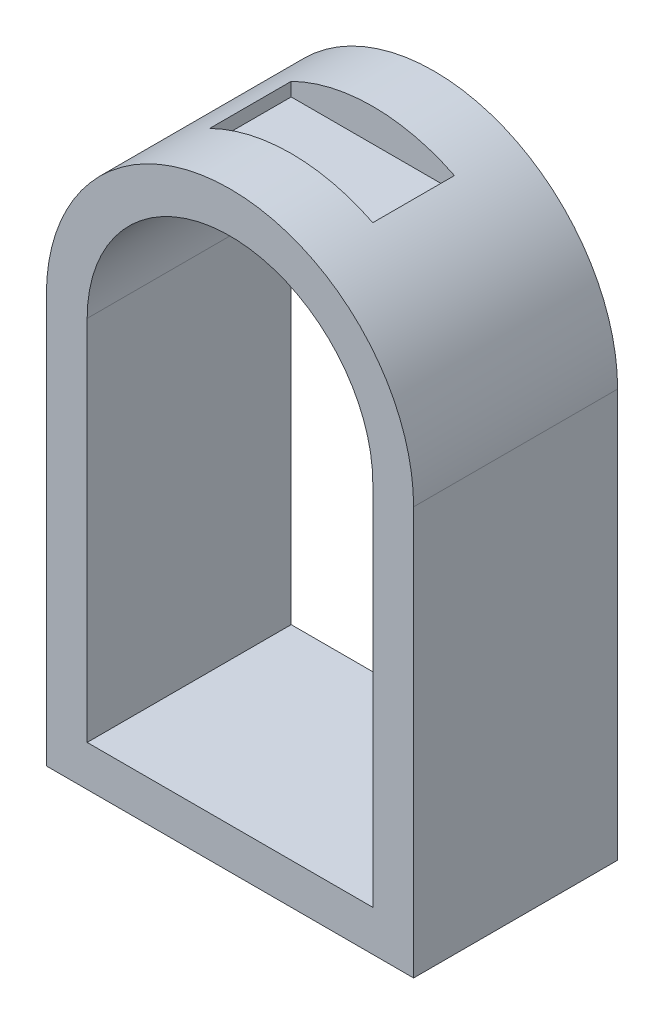
ISO-10303-21;
HEADER;
FILE_DESCRIPTION(('STEP AP214'),'2;1');
FILE_NAME('part.step','',(''),(''),'','','');
FILE_SCHEMA(('AUTOMOTIVE_DESIGN { 1 0 10303 214 1 1 1 1 }'));
ENDSEC;
DATA;
#1=APPLICATION_CONTEXT('core data for automotive mechanical design processes');
#2=APPLICATION_PROTOCOL_DEFINITION('international standard','automotive_design',2000,#1);
#3=PRODUCT_CONTEXT('',#1,'mechanical');
#4=PRODUCT('Part','Part','',(#3));
#5=PRODUCT_RELATED_PRODUCT_CATEGORY('part','',(#4));
#6=PRODUCT_DEFINITION_FORMATION('','',#4);
#7=PRODUCT_DEFINITION_CONTEXT('part definition',#1,'design');
#8=PRODUCT_DEFINITION('design','',#6,#7);
#9=PRODUCT_DEFINITION_SHAPE('','',#8);
#10=(LENGTH_UNIT() NAMED_UNIT(*) SI_UNIT(.MILLI.,.METRE.));
#11=(NAMED_UNIT(*) PLANE_ANGLE_UNIT() SI_UNIT($,.RADIAN.));
#12=(NAMED_UNIT(*) SI_UNIT($,.STERADIAN.) SOLID_ANGLE_UNIT());
#13=UNCERTAINTY_MEASURE_WITH_UNIT(LENGTH_MEASURE(1.E-05),#10,'distance_accuracy_value','');
#14=(GEOMETRIC_REPRESENTATION_CONTEXT(3) GLOBAL_UNCERTAINTY_ASSIGNED_CONTEXT((#13)) GLOBAL_UNIT_ASSIGNED_CONTEXT((#10,
#11,#12)) REPRESENTATION_CONTEXT('',''));
#15=CARTESIAN_POINT('',(0.,0.,0.));
#16=DIRECTION('',(0.,0.,1.));
#17=DIRECTION('',(1.,0.,0.));
#18=AXIS2_PLACEMENT_3D('',#15,#16,#17);
#19=CARTESIAN_POINT('',(88.8999999999999,228.6,127.));
#20=DIRECTION('',(0.,0.,-1.));
#21=DIRECTION('',(-1.,0.,0.));
#22=AXIS2_PLACEMENT_3D('',#19,#20,#21);
#23=CYLINDRICAL_SURFACE('',#22,114.3);
#24=CARTESIAN_POINT('',(88.8999999999999,228.6,0.));
#25=DIRECTION('',(0.,0.,1.));
#26=DIRECTION('',(-1.,0.,0.));
#27=AXIS2_PLACEMENT_3D('',#24,#25,#26);
#28=CIRCLE('',#27,114.3);
#29=CARTESIAN_POINT('',(203.2,228.6,0.));
#30=VERTEX_POINT('',#29);
#31=CARTESIAN_POINT('',(-25.4,228.6,0.));
#32=VERTEX_POINT('',#31);
#33=EDGE_CURVE('E236',#30,#32,#28,.T.);
#34=ORIENTED_EDGE('',*,*,#33,.T.);
#35=DIRECTION('',(0.,0.,-1.));
#36=VECTOR('',#35,1.);
#37=CARTESIAN_POINT('',(-25.4,228.6,127.));
#38=LINE('',#37,#36);
#39=CARTESIAN_POINT('',(-25.4,228.6,127.));
#40=VERTEX_POINT('',#39);
#41=EDGE_CURVE('E244',#40,#32,#38,.T.);
#42=ORIENTED_EDGE('',*,*,#41,.F.);
#43=CARTESIAN_POINT('',(88.8999999999999,228.6,127.));
#44=DIRECTION('',(0.,0.,1.));
#45=DIRECTION('',(-1.,0.,0.));
#46=AXIS2_PLACEMENT_3D('',#43,#44,#45);
#47=CIRCLE('',#46,114.3);
#48=CARTESIAN_POINT('',(203.2,228.6,127.));
#49=VERTEX_POINT('',#48);
#50=EDGE_CURVE('E223',#49,#40,#47,.T.);
#51=ORIENTED_EDGE('',*,*,#50,.F.);
#52=DIRECTION('',(0.,0.,-1.));
#53=VECTOR('',#52,1.);
#54=CARTESIAN_POINT('',(203.2,228.6,127.));
#55=LINE('',#54,#53);
#56=EDGE_CURVE('E248',#49,#30,#55,.T.);
#57=ORIENTED_EDGE('',*,*,#56,.T.);
#58=EDGE_LOOP('',(#34,#42,#51,#57));
#59=FACE_BOUND('',#58,.T.);
#60=DIRECTION('',(0.,0.,-1.));
#61=VECTOR('',#60,1.);
#62=CARTESIAN_POINT('',(38.1,330.990673403392,127.));
#63=LINE('',#62,#61);
#64=CARTESIAN_POINT('',(38.1,330.990673403392,38.1));
#65=VERTEX_POINT('',#64);
#66=CARTESIAN_POINT('',(38.1,330.990673403392,88.9));
#67=VERTEX_POINT('',#66);
#68=EDGE_CURVE('E11',#65,#67,#63,.F.);
#69=ORIENTED_EDGE('',*,*,#68,.F.);
#70=CARTESIAN_POINT('',(88.8999999999999,228.6,38.1));
#71=DIRECTION('',(0.,0.,1.));
#72=DIRECTION('',(1.,0.,0.));
#73=AXIS2_PLACEMENT_3D('',#70,#71,#72);
#74=CIRCLE('',#73,114.3);
#75=CARTESIAN_POINT('',(139.7,330.990673403392,38.1));
#76=VERTEX_POINT('',#75);
#77=EDGE_CURVE('E256',#76,#65,#74,.T.);
#78=ORIENTED_EDGE('',*,*,#77,.F.);
#79=DIRECTION('',(0.,0.,-1.));
#80=VECTOR('',#79,1.);
#81=CARTESIAN_POINT('',(139.7,330.990673403392,127.));
#82=LINE('',#81,#80);
#83=CARTESIAN_POINT('',(139.7,330.990673403392,88.9));
#84=VERTEX_POINT('',#83);
#85=EDGE_CURVE('E259',#84,#76,#82,.T.);
#86=ORIENTED_EDGE('',*,*,#85,.F.);
#87=CARTESIAN_POINT('',(88.8999999999999,228.6,88.9));
#88=DIRECTION('',(0.,0.,-1.));
#89=DIRECTION('',(-1.,0.,0.));
#90=AXIS2_PLACEMENT_3D('',#87,#88,#89);
#91=CIRCLE('',#90,114.3);
#92=EDGE_CURVE('E54',#67,#84,#91,.T.);
#93=ORIENTED_EDGE('',*,*,#92,.F.);
#94=EDGE_LOOP('',(#69,#78,#86,#93));
#95=FACE_BOUND('',#94,.T.);
#96=ADVANCED_FACE('F45',(#59,#95),#23,.T.);
#97=CARTESIAN_POINT('',(88.8999999999999,228.6,127.));
#98=DIRECTION('',(0.,0.,-1.));
#99=DIRECTION('',(-1.,0.,0.));
#100=AXIS2_PLACEMENT_3D('',#97,#98,#99);
#101=PLANE('',#100);
#102=DIRECTION('',(1.,0.,0.));
#103=VECTOR('',#102,1.);
#104=CARTESIAN_POINT('',(-25.4,-25.4,127.));
#105=LINE('',#104,#103);
#106=CARTESIAN_POINT('',(-25.4,-25.4,127.));
#107=VERTEX_POINT('',#106);
#108=CARTESIAN_POINT('',(203.2,-25.4,127.));
#109=VERTEX_POINT('',#108);
#110=EDGE_CURVE('E215',#107,#109,#105,.T.);
#111=ORIENTED_EDGE('',*,*,#110,.T.);
#112=DIRECTION('',(0.,1.,0.));
#113=VECTOR('',#112,1.);
#114=CARTESIAN_POINT('',(203.2,-25.4,127.));
#115=LINE('',#114,#113);
#116=EDGE_CURVE('E219',#109,#49,#115,.T.);
#117=ORIENTED_EDGE('',*,*,#116,.T.);
#118=ORIENTED_EDGE('',*,*,#50,.T.);
#119=DIRECTION('',(0.,-1.,0.));
#120=VECTOR('',#119,1.);
#121=CARTESIAN_POINT('',(-25.4,-25.4,127.));
#122=LINE('',#121,#120);
#123=EDGE_CURVE('E226',#40,#107,#122,.T.);
#124=ORIENTED_EDGE('',*,*,#123,.T.);
#125=EDGE_LOOP('',(#111,#117,#118,#124));
#126=FACE_BOUND('',#125,.T.);
#127=DIRECTION('',(0.,-1.,0.));
#128=VECTOR('',#127,1.);
#129=CARTESIAN_POINT('',(0.,0.,127.));
#130=LINE('',#129,#128);
#131=CARTESIAN_POINT('',(0.,228.6,127.));
#132=VERTEX_POINT('',#131);
#133=CARTESIAN_POINT('',(0.,0.,127.));
#134=VERTEX_POINT('',#133);
#135=EDGE_CURVE('E174',#132,#134,#130,.T.);
#136=ORIENTED_EDGE('',*,*,#135,.F.);
#137=CARTESIAN_POINT('',(88.8999999999999,228.6,127.));
#138=DIRECTION('',(0.,0.,1.));
#139=DIRECTION('',(-1.,0.,0.));
#140=AXIS2_PLACEMENT_3D('',#137,#138,#139);
#141=CIRCLE('',#140,88.9);
#142=CARTESIAN_POINT('',(177.8,228.6,127.));
#143=VERTEX_POINT('',#142);
#144=EDGE_CURVE('E184',#143,#132,#141,.T.);
#145=ORIENTED_EDGE('',*,*,#144,.F.);
#146=DIRECTION('',(0.,1.,0.));
#147=VECTOR('',#146,1.);
#148=CARTESIAN_POINT('',(177.8,0.,127.));
#149=LINE('',#148,#147);
#150=CARTESIAN_POINT('',(177.8,0.,127.));
#151=VERTEX_POINT('',#150);
#152=EDGE_CURVE('E181',#151,#143,#149,.T.);
#153=ORIENTED_EDGE('',*,*,#152,.F.);
#154=DIRECTION('',(1.,0.,0.));
#155=VECTOR('',#154,1.);
#156=CARTESIAN_POINT('',(0.,0.,127.));
#157=LINE('',#156,#155);
#158=EDGE_CURVE('E177',#134,#151,#157,.T.);
#159=ORIENTED_EDGE('',*,*,#158,.F.);
#160=EDGE_LOOP('',(#136,#145,#153,#159));
#161=FACE_BOUND('',#160,.T.);
#162=ADVANCED_FACE('F277',(#126,#161),#101,.F.);
#163=CARTESIAN_POINT('',(88.8999999999999,228.6,0.));
#164=DIRECTION('',(0.,0.,-1.));
#165=DIRECTION('',(-1.,0.,0.));
#166=AXIS2_PLACEMENT_3D('',#163,#164,#165);
#167=PLANE('',#166);
#168=DIRECTION('',(1.,0.,0.));
#169=VECTOR('',#168,1.);
#170=CARTESIAN_POINT('',(-25.4,-25.4,0.));
#171=LINE('',#170,#169);
#172=CARTESIAN_POINT('',(-25.4,-25.4,0.));
#173=VERTEX_POINT('',#172);
#174=CARTESIAN_POINT('',(203.2,-25.4,0.));
#175=VERTEX_POINT('',#174);
#176=EDGE_CURVE('E214',#173,#175,#171,.T.);
#177=ORIENTED_EDGE('',*,*,#176,.F.);
#178=DIRECTION('',(0.,-1.,0.));
#179=VECTOR('',#178,1.);
#180=CARTESIAN_POINT('',(-25.4,-25.4,0.));
#181=LINE('',#180,#179);
#182=EDGE_CURVE('E220',#32,#173,#181,.T.);
#183=ORIENTED_EDGE('',*,*,#182,.F.);
#184=ORIENTED_EDGE('',*,*,#33,.F.);
#185=DIRECTION('',(0.,1.,0.));
#186=VECTOR('',#185,1.);
#187=CARTESIAN_POINT('',(203.2,-25.4,0.));
#188=LINE('',#187,#186);
#189=EDGE_CURVE('E233',#175,#30,#188,.T.);
#190=ORIENTED_EDGE('',*,*,#189,.F.);
#191=EDGE_LOOP('',(#177,#183,#184,#190));
#192=FACE_BOUND('',#191,.T.);
#193=CARTESIAN_POINT('',(88.8999999999999,228.6,0.));
#194=DIRECTION('',(0.,0.,1.));
#195=DIRECTION('',(-1.,0.,0.));
#196=AXIS2_PLACEMENT_3D('',#193,#194,#195);
#197=CIRCLE('',#196,88.9);
#198=CARTESIAN_POINT('',(177.8,228.6,0.));
#199=VERTEX_POINT('',#198);
#200=CARTESIAN_POINT('',(0.,228.6,0.));
#201=VERTEX_POINT('',#200);
#202=EDGE_CURVE('E178',#199,#201,#197,.T.);
#203=ORIENTED_EDGE('',*,*,#202,.T.);
#204=DIRECTION('',(0.,-1.,0.));
#205=VECTOR('',#204,1.);
#206=CARTESIAN_POINT('',(0.,0.,0.));
#207=LINE('',#206,#205);
#208=CARTESIAN_POINT('',(0.,0.,0.));
#209=VERTEX_POINT('',#208);
#210=EDGE_CURVE('E145',#201,#209,#207,.T.);
#211=ORIENTED_EDGE('',*,*,#210,.T.);
#212=DIRECTION('',(1.,0.,0.));
#213=VECTOR('',#212,1.);
#214=CARTESIAN_POINT('',(0.,0.,0.));
#215=LINE('',#214,#213);
#216=CARTESIAN_POINT('',(177.8,0.,0.));
#217=VERTEX_POINT('',#216);
#218=EDGE_CURVE('E191',#209,#217,#215,.T.);
#219=ORIENTED_EDGE('',*,*,#218,.T.);
#220=DIRECTION('',(0.,1.,0.));
#221=VECTOR('',#220,1.);
#222=CARTESIAN_POINT('',(177.8,0.,0.));
#223=LINE('',#222,#221);
#224=EDGE_CURVE('E195',#217,#199,#223,.T.);
#225=ORIENTED_EDGE('',*,*,#224,.T.);
#226=EDGE_LOOP('',(#203,#211,#219,#225));
#227=FACE_BOUND('',#226,.T.);
#228=ADVANCED_FACE('F285',(#192,#227),#167,.T.);
#229=CARTESIAN_POINT('',(-25.4,-25.4,127.));
#230=DIRECTION('',(0.,1.,0.));
#231=DIRECTION('',(0.,0.,1.));
#232=AXIS2_PLACEMENT_3D('',#229,#230,#231);
#233=PLANE('',#232);
#234=ORIENTED_EDGE('',*,*,#176,.T.);
#235=DIRECTION('',(0.,0.,-1.));
#236=VECTOR('',#235,1.);
#237=CARTESIAN_POINT('',(203.2,-25.4,127.));
#238=LINE('',#237,#236);
#239=EDGE_CURVE('E252',#109,#175,#238,.T.);
#240=ORIENTED_EDGE('',*,*,#239,.F.);
#241=ORIENTED_EDGE('',*,*,#110,.F.);
#242=DIRECTION('',(0.,0.,-1.));
#243=VECTOR('',#242,1.);
#244=CARTESIAN_POINT('',(-25.4,-25.4,127.));
#245=LINE('',#244,#243);
#246=EDGE_CURVE('E229',#107,#173,#245,.T.);
#247=ORIENTED_EDGE('',*,*,#246,.T.);
#248=EDGE_LOOP('',(#234,#240,#241,#247));
#249=FACE_BOUND('',#248,.T.);
#250=ADVANCED_FACE('F47',(#249),#233,.F.);
#251=CARTESIAN_POINT('',(203.2,-25.4,127.));
#252=DIRECTION('',(-1.,0.,0.));
#253=DIRECTION('',(0.,-1.,0.));
#254=AXIS2_PLACEMENT_3D('',#251,#252,#253);
#255=PLANE('',#254);
#256=ORIENTED_EDGE('',*,*,#189,.T.);
#257=ORIENTED_EDGE('',*,*,#56,.F.);
#258=ORIENTED_EDGE('',*,*,#116,.F.);
#259=ORIENTED_EDGE('',*,*,#239,.T.);
#260=EDGE_LOOP('',(#256,#257,#258,#259));
#261=FACE_BOUND('',#260,.T.);
#262=ADVANCED_FACE('F291',(#261),#255,.F.);
#263=CARTESIAN_POINT('',(-25.4,-25.4,127.));
#264=DIRECTION('',(1.,0.,0.));
#265=DIRECTION('',(0.,0.,-1.));
#266=AXIS2_PLACEMENT_3D('',#263,#264,#265);
#267=PLANE('',#266);
#268=ORIENTED_EDGE('',*,*,#182,.T.);
#269=ORIENTED_EDGE('',*,*,#246,.F.);
#270=ORIENTED_EDGE('',*,*,#123,.F.);
#271=ORIENTED_EDGE('',*,*,#41,.T.);
#272=EDGE_LOOP('',(#268,#269,#270,#271));
#273=FACE_BOUND('',#272,.T.);
#274=ADVANCED_FACE('F289',(#273),#267,.F.);
#275=CARTESIAN_POINT('',(0.,0.,127.));
#276=DIRECTION('',(1.,0.,0.));
#277=DIRECTION('',(0.,1.,0.));
#278=AXIS2_PLACEMENT_3D('',#275,#276,#277);
#279=PLANE('',#278);
#280=ORIENTED_EDGE('',*,*,#210,.F.);
#281=DIRECTION('',(0.,0.,-1.));
#282=VECTOR('',#281,1.);
#283=CARTESIAN_POINT('',(0.,228.6,127.));
#284=LINE('',#283,#282);
#285=EDGE_CURVE('E187',#132,#201,#284,.T.);
#286=ORIENTED_EDGE('',*,*,#285,.F.);
#287=ORIENTED_EDGE('',*,*,#135,.T.);
#288=DIRECTION('',(0.,0.,-1.));
#289=VECTOR('',#288,1.);
#290=CARTESIAN_POINT('',(0.,0.,127.));
#291=LINE('',#290,#289);
#292=EDGE_CURVE('E210',#134,#209,#291,.T.);
#293=ORIENTED_EDGE('',*,*,#292,.T.);
#294=EDGE_LOOP('',(#280,#286,#287,#293));
#295=FACE_BOUND('',#294,.T.);
#296=ADVANCED_FACE('F298',(#295),#279,.T.);
#297=CARTESIAN_POINT('',(0.,0.,127.));
#298=DIRECTION('',(0.,1.,0.));
#299=DIRECTION('',(0.,0.,1.));
#300=AXIS2_PLACEMENT_3D('',#297,#298,#299);
#301=PLANE('',#300);
#302=ORIENTED_EDGE('',*,*,#218,.F.);
#303=ORIENTED_EDGE('',*,*,#292,.F.);
#304=ORIENTED_EDGE('',*,*,#158,.T.);
#305=DIRECTION('',(0.,0.,-1.));
#306=VECTOR('',#305,1.);
#307=CARTESIAN_POINT('',(177.8,0.,127.));
#308=LINE('',#307,#306);
#309=EDGE_CURVE('E207',#151,#217,#308,.T.);
#310=ORIENTED_EDGE('',*,*,#309,.T.);
#311=EDGE_LOOP('',(#302,#303,#304,#310));
#312=FACE_BOUND('',#311,.T.);
#313=ADVANCED_FACE('F322',(#312),#301,.T.);
#314=CARTESIAN_POINT('',(177.8,0.,127.));
#315=DIRECTION('',(-1.,0.,0.));
#316=DIRECTION('',(0.,0.,1.));
#317=AXIS2_PLACEMENT_3D('',#314,#315,#316);
#318=PLANE('',#317);
#319=ORIENTED_EDGE('',*,*,#224,.F.);
#320=ORIENTED_EDGE('',*,*,#309,.F.);
#321=ORIENTED_EDGE('',*,*,#152,.T.);
#322=DIRECTION('',(0.,0.,-1.));
#323=VECTOR('',#322,1.);
#324=CARTESIAN_POINT('',(177.8,228.6,127.));
#325=LINE('',#324,#323);
#326=EDGE_CURVE('E69',#143,#199,#325,.T.);
#327=ORIENTED_EDGE('',*,*,#326,.T.);
#328=EDGE_LOOP('',(#319,#320,#321,#327));
#329=FACE_BOUND('',#328,.T.);
#330=ADVANCED_FACE('F326',(#329),#318,.T.);
#331=CARTESIAN_POINT('',(88.8999999999999,228.6,127.));
#332=DIRECTION('',(0.,0.,-1.));
#333=DIRECTION('',(-1.,0.,0.));
#334=AXIS2_PLACEMENT_3D('',#331,#332,#333);
#335=CYLINDRICAL_SURFACE('',#334,88.9);
#336=ORIENTED_EDGE('',*,*,#202,.F.);
#337=ORIENTED_EDGE('',*,*,#326,.F.);
#338=ORIENTED_EDGE('',*,*,#144,.T.);
#339=ORIENTED_EDGE('',*,*,#285,.T.);
#340=EDGE_LOOP('',(#336,#337,#338,#339));
#341=FACE_BOUND('',#340,.T.);
#342=ADVANCED_FACE('F325',(#341),#335,.F.);
#343=CARTESIAN_POINT('',(38.1,342.900012,38.1));
#344=DIRECTION('',(1.,0.,0.));
#345=DIRECTION('',(0.,0.,-1.));
#346=AXIS2_PLACEMENT_3D('',#343,#344,#345);
#347=PLANE('',#346);
#348=ORIENTED_EDGE('',*,*,#68,.T.);
#349=DIRECTION('',(0.,-1.,0.));
#350=VECTOR('',#349,1.);
#351=CARTESIAN_POINT('',(38.1,342.900012,88.9));
#352=LINE('',#351,#350);
#353=CARTESIAN_POINT('',(38.1,322.58,88.9));
#354=VERTEX_POINT('',#353);
#355=EDGE_CURVE('E134',#67,#354,#352,.T.);
#356=ORIENTED_EDGE('',*,*,#355,.T.);
#357=DIRECTION('',(0.,0.,1.));
#358=VECTOR('',#357,1.);
#359=CARTESIAN_POINT('',(38.1,322.58,38.1));
#360=LINE('',#359,#358);
#361=CARTESIAN_POINT('',(38.1,322.58,38.1));
#362=VERTEX_POINT('',#361);
#363=EDGE_CURVE('E139',#362,#354,#360,.T.);
#364=ORIENTED_EDGE('',*,*,#363,.F.);
#365=DIRECTION('',(0.,-1.,0.));
#366=VECTOR('',#365,1.);
#367=CARTESIAN_POINT('',(38.1,342.900012,38.1));
#368=LINE('',#367,#366);
#369=EDGE_CURVE('E167',#65,#362,#368,.T.);
#370=ORIENTED_EDGE('',*,*,#369,.F.);
#371=EDGE_LOOP('',(#348,#356,#364,#370));
#372=FACE_BOUND('',#371,.T.);
#373=ADVANCED_FACE('F136',(#372),#347,.T.);
#374=CARTESIAN_POINT('',(38.1,342.900012,88.9));
#375=DIRECTION('',(0.,0.,-1.));
#376=DIRECTION('',(-1.,0.,0.));
#377=AXIS2_PLACEMENT_3D('',#374,#375,#376);
#378=PLANE('',#377);
#379=ORIENTED_EDGE('',*,*,#92,.T.);
#380=DIRECTION('',(0.,-1.,0.));
#381=VECTOR('',#380,1.);
#382=CARTESIAN_POINT('',(139.7,342.900012,88.9));
#383=LINE('',#382,#381);
#384=CARTESIAN_POINT('',(139.7,322.58,88.9));
#385=VERTEX_POINT('',#384);
#386=EDGE_CURVE('E146',#84,#385,#383,.T.);
#387=ORIENTED_EDGE('',*,*,#386,.T.);
#388=DIRECTION('',(1.,0.,0.));
#389=VECTOR('',#388,1.);
#390=CARTESIAN_POINT('',(38.1,322.58,88.9));
#391=LINE('',#390,#389);
#392=EDGE_CURVE('E149',#354,#385,#391,.T.);
#393=ORIENTED_EDGE('',*,*,#392,.F.);
#394=ORIENTED_EDGE('',*,*,#355,.F.);
#395=EDGE_LOOP('',(#379,#387,#393,#394));
#396=FACE_BOUND('',#395,.T.);
#397=ADVANCED_FACE('F150',(#396),#378,.T.);
#398=CARTESIAN_POINT('',(139.7,342.900012,38.1));
#399=DIRECTION('',(-1.,0.,0.));
#400=DIRECTION('',(0.,0.,1.));
#401=AXIS2_PLACEMENT_3D('',#398,#399,#400);
#402=PLANE('',#401);
#403=ORIENTED_EDGE('',*,*,#85,.T.);
#404=DIRECTION('',(0.,-1.,0.));
#405=VECTOR('',#404,1.);
#406=CARTESIAN_POINT('',(139.7,342.900012,38.1));
#407=LINE('',#406,#405);
#408=CARTESIAN_POINT('',(139.7,322.58,38.1));
#409=VERTEX_POINT('',#408);
#410=EDGE_CURVE('E61',#76,#409,#407,.T.);
#411=ORIENTED_EDGE('',*,*,#410,.T.);
#412=DIRECTION('',(0.,0.,-1.));
#413=VECTOR('',#412,1.);
#414=CARTESIAN_POINT('',(139.7,322.58,38.1));
#415=LINE('',#414,#413);
#416=EDGE_CURVE('E156',#385,#409,#415,.T.);
#417=ORIENTED_EDGE('',*,*,#416,.F.);
#418=ORIENTED_EDGE('',*,*,#386,.F.);
#419=EDGE_LOOP('',(#403,#411,#417,#418));
#420=FACE_BOUND('',#419,.T.);
#421=ADVANCED_FACE('F265',(#420),#402,.T.);
#422=CARTESIAN_POINT('',(38.1,342.900012,38.1));
#423=DIRECTION('',(0.,0.,1.));
#424=DIRECTION('',(1.,0.,0.));
#425=AXIS2_PLACEMENT_3D('',#422,#423,#424);
#426=PLANE('',#425);
#427=ORIENTED_EDGE('',*,*,#77,.T.);
#428=ORIENTED_EDGE('',*,*,#369,.T.);
#429=DIRECTION('',(-1.,0.,0.));
#430=VECTOR('',#429,1.);
#431=CARTESIAN_POINT('',(38.1,322.58,38.1));
#432=LINE('',#431,#430);
#433=EDGE_CURVE('E159',#409,#362,#432,.T.);
#434=ORIENTED_EDGE('',*,*,#433,.F.);
#435=ORIENTED_EDGE('',*,*,#410,.F.);
#436=EDGE_LOOP('',(#427,#428,#434,#435));
#437=FACE_BOUND('',#436,.T.);
#438=ADVANCED_FACE('F267',(#437),#426,.T.);
#439=CARTESIAN_POINT('',(0.,322.58,0.));
#440=DIRECTION('',(0.,1.,0.));
#441=DIRECTION('',(0.,0.,1.));
#442=AXIS2_PLACEMENT_3D('',#439,#440,#441);
#443=PLANE('',#442);
#444=ORIENTED_EDGE('',*,*,#363,.T.);
#445=ORIENTED_EDGE('',*,*,#392,.T.);
#446=ORIENTED_EDGE('',*,*,#416,.T.);
#447=ORIENTED_EDGE('',*,*,#433,.T.);
#448=EDGE_LOOP('',(#444,#445,#446,#447));
#449=FACE_BOUND('',#448,.T.);
#450=ADVANCED_FACE('F158',(#449),#443,.T.);
#451=CLOSED_SHELL('',(#96,#162,#228,#250,#262,#274,#296,#313,#330,#342,#373,#397,#421,#438,#450));
#452=MANIFOLD_SOLID_BREP('B2',#451);
#453=ADVANCED_BREP_SHAPE_REPRESENTATION('',(#18,#452),#14);
#454=SHAPE_DEFINITION_REPRESENTATION(#9,#453);
ENDSEC;
END-ISO-10303-21;
